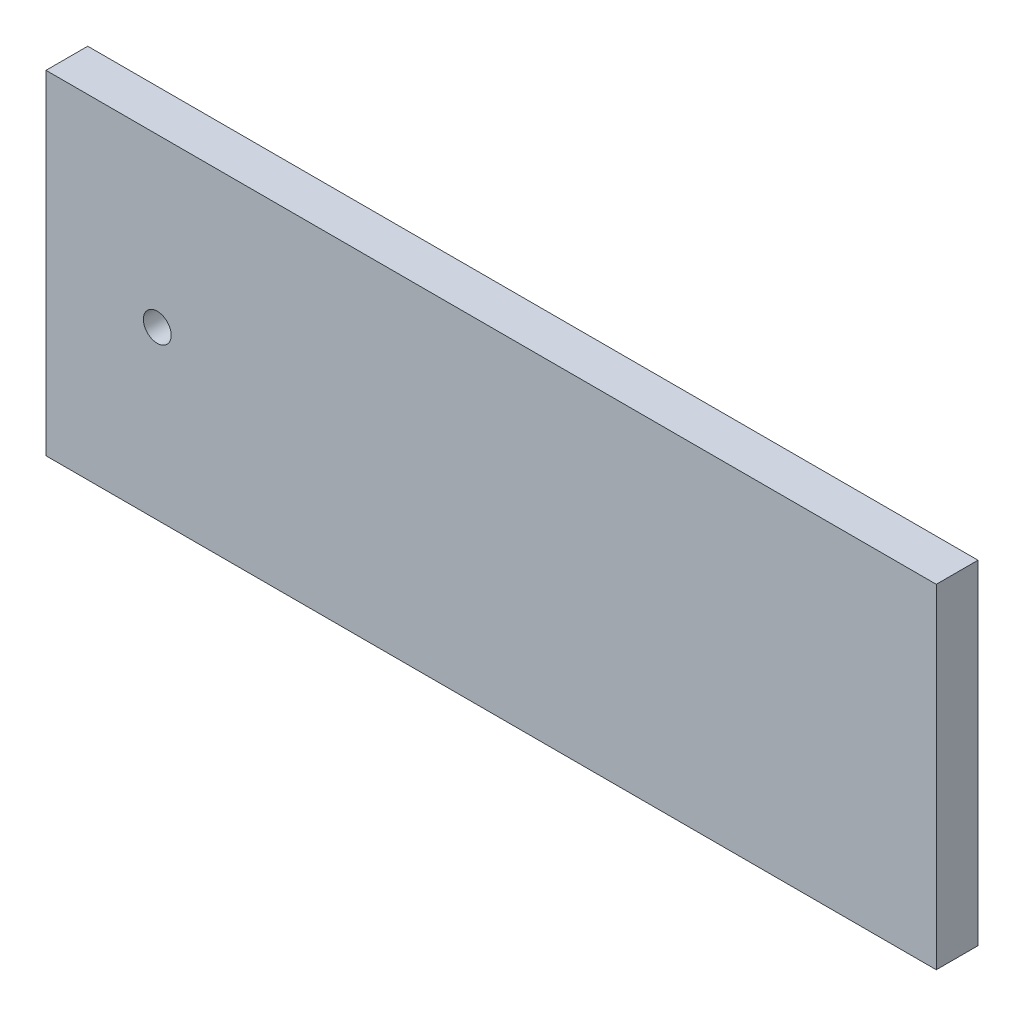
ISO-10303-21;
HEADER;
FILE_DESCRIPTION(('STEP AP214'),'2;1');
FILE_NAME('part.step','',(''),(''),'','','');
FILE_SCHEMA(('AUTOMOTIVE_DESIGN { 1 0 10303 214 1 1 1 1 }'));
ENDSEC;
DATA;
#1=APPLICATION_CONTEXT('core data for automotive mechanical design processes');
#2=APPLICATION_PROTOCOL_DEFINITION('international standard','automotive_design',2000,#1);
#3=PRODUCT_CONTEXT('',#1,'mechanical');
#4=PRODUCT('Part','Part','',(#3));
#5=PRODUCT_RELATED_PRODUCT_CATEGORY('part','',(#4));
#6=PRODUCT_DEFINITION_FORMATION('','',#4);
#7=PRODUCT_DEFINITION_CONTEXT('part definition',#1,'design');
#8=PRODUCT_DEFINITION('design','',#6,#7);
#9=PRODUCT_DEFINITION_SHAPE('','',#8);
#10=(LENGTH_UNIT() NAMED_UNIT(*) SI_UNIT(.MILLI.,.METRE.));
#11=(NAMED_UNIT(*) PLANE_ANGLE_UNIT() SI_UNIT($,.RADIAN.));
#12=(NAMED_UNIT(*) SI_UNIT($,.STERADIAN.) SOLID_ANGLE_UNIT());
#13=UNCERTAINTY_MEASURE_WITH_UNIT(LENGTH_MEASURE(1.E-05),#10,'distance_accuracy_value','');
#14=(GEOMETRIC_REPRESENTATION_CONTEXT(3) GLOBAL_UNCERTAINTY_ASSIGNED_CONTEXT((#13)) GLOBAL_UNIT_ASSIGNED_CONTEXT((#10,
#11,#12)) REPRESENTATION_CONTEXT('',''));
#15=CARTESIAN_POINT('',(0.,0.,0.));
#16=DIRECTION('',(0.,0.,1.));
#17=DIRECTION('',(1.,0.,0.));
#18=AXIS2_PLACEMENT_3D('',#15,#16,#17);
#19=CARTESIAN_POINT('',(0.,0.,9.525));
#20=DIRECTION('',(1.,0.,0.));
#21=DIRECTION('',(0.,0.,-1.));
#22=AXIS2_PLACEMENT_3D('',#19,#20,#21);
#23=PLANE('',#22);
#24=DIRECTION('',(0.,-1.,0.));
#25=VECTOR('',#24,1.);
#26=CARTESIAN_POINT('',(0.,0.,0.));
#27=LINE('',#26,#25);
#28=CARTESIAN_POINT('',(0.,76.2,0.));
#29=VERTEX_POINT('',#28);
#30=CARTESIAN_POINT('',(0.,0.,0.));
#31=VERTEX_POINT('',#30);
#32=EDGE_CURVE('E105',#29,#31,#27,.T.);
#33=ORIENTED_EDGE('',*,*,#32,.T.);
#34=DIRECTION('',(0.,0.,-1.));
#35=VECTOR('',#34,1.);
#36=CARTESIAN_POINT('',(0.,0.,9.525));
#37=LINE('',#36,#35);
#38=CARTESIAN_POINT('',(0.,0.,9.525));
#39=VERTEX_POINT('',#38);
#40=EDGE_CURVE('E11',#39,#31,#37,.T.);
#41=ORIENTED_EDGE('',*,*,#40,.F.);
#42=DIRECTION('',(0.,-1.,0.));
#43=VECTOR('',#42,1.);
#44=CARTESIAN_POINT('',(0.,0.,9.525));
#45=LINE('',#44,#43);
#46=CARTESIAN_POINT('',(0.,76.2,9.525));
#47=VERTEX_POINT('',#46);
#48=EDGE_CURVE('E89',#47,#39,#45,.T.);
#49=ORIENTED_EDGE('',*,*,#48,.F.);
#50=DIRECTION('',(0.,0.,-1.));
#51=VECTOR('',#50,1.);
#52=CARTESIAN_POINT('',(0.,76.2,9.525));
#53=LINE('',#52,#51);
#54=EDGE_CURVE('E98',#47,#29,#53,.T.);
#55=ORIENTED_EDGE('',*,*,#54,.T.);
#56=EDGE_LOOP('',(#33,#41,#49,#55));
#57=FACE_BOUND('',#56,.T.);
#58=ADVANCED_FACE('F39',(#57),#23,.F.);
#59=CARTESIAN_POINT('',(0.,0.,9.525));
#60=DIRECTION('',(0.,1.,0.));
#61=DIRECTION('',(0.,0.,1.));
#62=AXIS2_PLACEMENT_3D('',#59,#60,#61);
#63=PLANE('',#62);
#64=DIRECTION('',(1.,0.,0.));
#65=VECTOR('',#64,1.);
#66=CARTESIAN_POINT('',(0.,0.,0.));
#67=LINE('',#66,#65);
#68=CARTESIAN_POINT('',(203.2,0.,0.));
#69=VERTEX_POINT('',#68);
#70=EDGE_CURVE('E94',#31,#69,#67,.T.);
#71=ORIENTED_EDGE('',*,*,#70,.T.);
#72=DIRECTION('',(0.,0.,-1.));
#73=VECTOR('',#72,1.);
#74=CARTESIAN_POINT('',(203.2,0.,9.525));
#75=LINE('',#74,#73);
#76=CARTESIAN_POINT('',(203.2,0.,9.525));
#77=VERTEX_POINT('',#76);
#78=EDGE_CURVE('E50',#77,#69,#75,.T.);
#79=ORIENTED_EDGE('',*,*,#78,.F.);
#80=DIRECTION('',(1.,0.,0.));
#81=VECTOR('',#80,1.);
#82=CARTESIAN_POINT('',(0.,0.,9.525));
#83=LINE('',#82,#81);
#84=EDGE_CURVE('E84',#39,#77,#83,.T.);
#85=ORIENTED_EDGE('',*,*,#84,.F.);
#86=ORIENTED_EDGE('',*,*,#40,.T.);
#87=EDGE_LOOP('',(#71,#79,#85,#86));
#88=FACE_BOUND('',#87,.T.);
#89=ADVANCED_FACE('F91',(#88),#63,.F.);
#90=CARTESIAN_POINT('',(203.2,0.,9.525));
#91=DIRECTION('',(-1.,0.,0.));
#92=DIRECTION('',(0.,0.,1.));
#93=AXIS2_PLACEMENT_3D('',#90,#91,#92);
#94=PLANE('',#93);
#95=DIRECTION('',(0.,1.,0.));
#96=VECTOR('',#95,1.);
#97=CARTESIAN_POINT('',(203.2,0.,0.));
#98=LINE('',#97,#96);
#99=CARTESIAN_POINT('',(203.2,76.2,0.));
#100=VERTEX_POINT('',#99);
#101=EDGE_CURVE('E75',#69,#100,#98,.T.);
#102=ORIENTED_EDGE('',*,*,#101,.T.);
#103=DIRECTION('',(0.,0.,-1.));
#104=VECTOR('',#103,1.);
#105=CARTESIAN_POINT('',(203.2,76.2,9.525));
#106=LINE('',#105,#104);
#107=CARTESIAN_POINT('',(203.2,76.2,9.525));
#108=VERTEX_POINT('',#107);
#109=EDGE_CURVE('E92',#108,#100,#106,.T.);
#110=ORIENTED_EDGE('',*,*,#109,.F.);
#111=DIRECTION('',(0.,1.,0.));
#112=VECTOR('',#111,1.);
#113=CARTESIAN_POINT('',(203.2,0.,9.525));
#114=LINE('',#113,#112);
#115=EDGE_CURVE('E86',#77,#108,#114,.T.);
#116=ORIENTED_EDGE('',*,*,#115,.F.);
#117=ORIENTED_EDGE('',*,*,#78,.T.);
#118=EDGE_LOOP('',(#102,#110,#116,#117));
#119=FACE_BOUND('',#118,.T.);
#120=ADVANCED_FACE('F96',(#119),#94,.F.);
#121=CARTESIAN_POINT('',(0.,76.2,9.525));
#122=DIRECTION('',(0.,-1.,0.));
#123=DIRECTION('',(0.,0.,-1.));
#124=AXIS2_PLACEMENT_3D('',#121,#122,#123);
#125=PLANE('',#124);
#126=DIRECTION('',(-1.,0.,0.));
#127=VECTOR('',#126,1.);
#128=CARTESIAN_POINT('',(0.,76.2,0.));
#129=LINE('',#128,#127);
#130=EDGE_CURVE('E79',#100,#29,#129,.T.);
#131=ORIENTED_EDGE('',*,*,#130,.T.);
#132=ORIENTED_EDGE('',*,*,#54,.F.);
#133=DIRECTION('',(-1.,0.,0.));
#134=VECTOR('',#133,1.);
#135=CARTESIAN_POINT('',(0.,76.2,9.525));
#136=LINE('',#135,#134);
#137=EDGE_CURVE('E54',#108,#47,#136,.T.);
#138=ORIENTED_EDGE('',*,*,#137,.F.);
#139=ORIENTED_EDGE('',*,*,#109,.T.);
#140=EDGE_LOOP('',(#131,#132,#138,#139));
#141=FACE_BOUND('',#140,.T.);
#142=ADVANCED_FACE('F109',(#141),#125,.F.);
#143=CARTESIAN_POINT('',(0.,0.,9.525));
#144=DIRECTION('',(0.,0.,-1.));
#145=DIRECTION('',(-1.,0.,0.));
#146=AXIS2_PLACEMENT_3D('',#143,#144,#145);
#147=PLANE('',#146);
#148=CARTESIAN_POINT('',(25.4,38.1,9.525));
#149=DIRECTION('',(0.,0.,1.));
#150=DIRECTION('',(1.,0.,0.));
#151=AXIS2_PLACEMENT_3D('',#148,#149,#150);
#152=CIRCLE('',#151,3.175);
#153=CARTESIAN_POINT('',(28.575,38.1,9.525));
#154=VERTEX_POINT('',#153);
#155=EDGE_CURVE('E104',#154,#154,#152,.T.);
#156=ORIENTED_EDGE('',*,*,#155,.F.);
#157=EDGE_LOOP('',(#156));
#158=FACE_BOUND('',#157,.T.);
#159=ORIENTED_EDGE('',*,*,#48,.T.);
#160=ORIENTED_EDGE('',*,*,#84,.T.);
#161=ORIENTED_EDGE('',*,*,#115,.T.);
#162=ORIENTED_EDGE('',*,*,#137,.T.);
#163=EDGE_LOOP('',(#159,#160,#161,#162));
#164=FACE_BOUND('',#163,.T.);
#165=ADVANCED_FACE('F88',(#158,#164),#147,.F.);
#166=CARTESIAN_POINT('',(0.,0.,0.));
#167=DIRECTION('',(0.,0.,-1.));
#168=DIRECTION('',(-1.,0.,0.));
#169=AXIS2_PLACEMENT_3D('',#166,#167,#168);
#170=PLANE('',#169);
#171=CARTESIAN_POINT('',(25.4,38.1,0.));
#172=DIRECTION('',(0.,0.,1.));
#173=DIRECTION('',(1.,0.,0.));
#174=AXIS2_PLACEMENT_3D('',#171,#172,#173);
#175=CIRCLE('',#174,3.175);
#176=CARTESIAN_POINT('',(28.575,38.1,0.));
#177=VERTEX_POINT('',#176);
#178=EDGE_CURVE('E119',#177,#177,#175,.T.);
#179=ORIENTED_EDGE('',*,*,#178,.T.);
#180=EDGE_LOOP('',(#179));
#181=FACE_BOUND('',#180,.T.);
#182=ORIENTED_EDGE('',*,*,#32,.F.);
#183=ORIENTED_EDGE('',*,*,#130,.F.);
#184=ORIENTED_EDGE('',*,*,#101,.F.);
#185=ORIENTED_EDGE('',*,*,#70,.F.);
#186=EDGE_LOOP('',(#182,#183,#184,#185));
#187=FACE_BOUND('',#186,.T.);
#188=ADVANCED_FACE('F114',(#181,#187),#170,.T.);
#189=CARTESIAN_POINT('',(25.4,38.1,9.525));
#190=DIRECTION('',(0.,0.,-1.));
#191=DIRECTION('',(-1.,0.,0.));
#192=AXIS2_PLACEMENT_3D('',#189,#190,#191);
#193=CYLINDRICAL_SURFACE('',#192,3.175);
#194=ORIENTED_EDGE('',*,*,#155,.T.);
#195=EDGE_LOOP('',(#194));
#196=FACE_BOUND('',#195,.T.);
#197=ORIENTED_EDGE('',*,*,#178,.F.);
#198=EDGE_LOOP('',(#197));
#199=FACE_BOUND('',#198,.T.);
#200=ADVANCED_FACE('F125',(#196,#199),#193,.F.);
#201=CLOSED_SHELL('',(#58,#89,#120,#142,#165,#188,#200));
#202=MANIFOLD_SOLID_BREP('B2',#201);
#203=ADVANCED_BREP_SHAPE_REPRESENTATION('',(#18,#202),#14);
#204=SHAPE_DEFINITION_REPRESENTATION(#9,#203);
ENDSEC;
END-ISO-10303-21;
